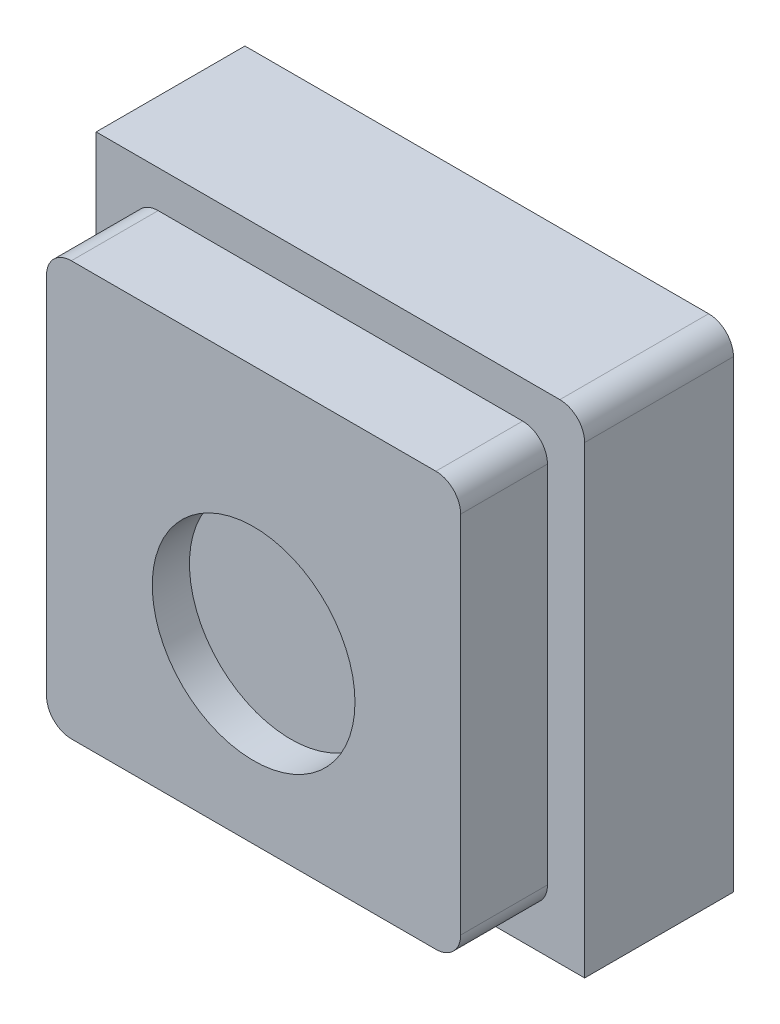
ISO-10303-21;
HEADER;
FILE_DESCRIPTION(('STEP AP214'),'2;1');
FILE_NAME('part.step','',(''),(''),'','','');
FILE_SCHEMA(('AUTOMOTIVE_DESIGN { 1 0 10303 214 1 1 1 1 }'));
ENDSEC;
DATA;
#1=APPLICATION_CONTEXT('core data for automotive mechanical design processes');
#2=APPLICATION_PROTOCOL_DEFINITION('international standard','automotive_design',2000,#1);
#3=PRODUCT_CONTEXT('',#1,'mechanical');
#4=PRODUCT('Part','Part','',(#3));
#5=PRODUCT_RELATED_PRODUCT_CATEGORY('part','',(#4));
#6=PRODUCT_DEFINITION_FORMATION('','',#4);
#7=PRODUCT_DEFINITION_CONTEXT('part definition',#1,'design');
#8=PRODUCT_DEFINITION('design','',#6,#7);
#9=PRODUCT_DEFINITION_SHAPE('','',#8);
#10=(LENGTH_UNIT() NAMED_UNIT(*) SI_UNIT(.MILLI.,.METRE.));
#11=(NAMED_UNIT(*) PLANE_ANGLE_UNIT() SI_UNIT($,.RADIAN.));
#12=(NAMED_UNIT(*) SI_UNIT($,.STERADIAN.) SOLID_ANGLE_UNIT());
#13=UNCERTAINTY_MEASURE_WITH_UNIT(LENGTH_MEASURE(1.E-05),#10,'distance_accuracy_value','');
#14=(GEOMETRIC_REPRESENTATION_CONTEXT(3) GLOBAL_UNCERTAINTY_ASSIGNED_CONTEXT((#13)) GLOBAL_UNIT_ASSIGNED_CONTEXT((#10,
#11,#12)) REPRESENTATION_CONTEXT('',''));
#15=CARTESIAN_POINT('',(0.,0.,0.));
#16=DIRECTION('',(0.,0.,1.));
#17=DIRECTION('',(1.,0.,0.));
#18=AXIS2_PLACEMENT_3D('',#15,#16,#17);
#19=CARTESIAN_POINT('',(-16.7,16.7,7.));
#20=DIRECTION('',(1.,0.,0.));
#21=DIRECTION('',(0.,1.,0.));
#22=AXIS2_PLACEMENT_3D('',#19,#20,#21);
#23=PLANE('',#22);
#24=DIRECTION('',(0.,-1.,0.));
#25=VECTOR('',#24,1.);
#26=CARTESIAN_POINT('',(-16.7,16.7,7.));
#27=LINE('',#26,#25);
#28=CARTESIAN_POINT('',(-16.7,14.7,7.));
#29=VERTEX_POINT('',#28);
#30=CARTESIAN_POINT('',(-16.7,-14.7,7.));
#31=VERTEX_POINT('',#30);
#32=EDGE_CURVE('E251',#29,#31,#27,.T.);
#33=ORIENTED_EDGE('',*,*,#32,.F.);
#34=DIRECTION('',(0.,0.,-1.));
#35=VECTOR('',#34,1.);
#36=CARTESIAN_POINT('',(-16.7,14.7,7.));
#37=LINE('',#36,#35);
#38=CARTESIAN_POINT('',(-16.7,14.7,0.));
#39=VERTEX_POINT('',#38);
#40=EDGE_CURVE('E233',#29,#39,#37,.T.);
#41=ORIENTED_EDGE('',*,*,#40,.T.);
#42=DIRECTION('',(0.,-1.,0.));
#43=VECTOR('',#42,1.);
#44=CARTESIAN_POINT('',(-16.7,16.7,0.));
#45=LINE('',#44,#43);
#46=CARTESIAN_POINT('',(-16.7,-14.7,0.));
#47=VERTEX_POINT('',#46);
#48=EDGE_CURVE('E246',#39,#47,#45,.T.);
#49=ORIENTED_EDGE('',*,*,#48,.T.);
#50=DIRECTION('',(0.,0.,-1.));
#51=VECTOR('',#50,1.);
#52=CARTESIAN_POINT('',(-16.7,-14.7,7.));
#53=LINE('',#52,#51);
#54=EDGE_CURVE('E231',#47,#31,#53,.F.);
#55=ORIENTED_EDGE('',*,*,#54,.T.);
#56=EDGE_LOOP('',(#33,#41,#49,#55));
#57=FACE_BOUND('',#56,.T.);
#58=ADVANCED_FACE('F35',(#57),#23,.F.);
#59=CARTESIAN_POINT('',(-16.7,-16.7,7.));
#60=DIRECTION('',(0.,1.,0.));
#61=DIRECTION('',(0.,0.,1.));
#62=AXIS2_PLACEMENT_3D('',#59,#60,#61);
#63=PLANE('',#62);
#64=DIRECTION('',(1.,0.,0.));
#65=VECTOR('',#64,1.);
#66=CARTESIAN_POINT('',(-16.7,-16.7,0.));
#67=LINE('',#66,#65);
#68=CARTESIAN_POINT('',(-14.7,-16.7,0.));
#69=VERTEX_POINT('',#68);
#70=CARTESIAN_POINT('',(14.7,-16.7,0.));
#71=VERTEX_POINT('',#70);
#72=EDGE_CURVE('E274',#69,#71,#67,.T.);
#73=ORIENTED_EDGE('',*,*,#72,.T.);
#74=DIRECTION('',(0.,0.,-1.));
#75=VECTOR('',#74,1.);
#76=CARTESIAN_POINT('',(14.7,-16.7,7.));
#77=LINE('',#76,#75);
#78=CARTESIAN_POINT('',(14.7,-16.7,7.));
#79=VERTEX_POINT('',#78);
#80=EDGE_CURVE('E218',#71,#79,#77,.F.);
#81=ORIENTED_EDGE('',*,*,#80,.T.);
#82=DIRECTION('',(1.,0.,0.));
#83=VECTOR('',#82,1.);
#84=CARTESIAN_POINT('',(-16.7,-16.7,7.));
#85=LINE('',#84,#83);
#86=CARTESIAN_POINT('',(-14.7,-16.7,7.));
#87=VERTEX_POINT('',#86);
#88=EDGE_CURVE('E263',#87,#79,#85,.T.);
#89=ORIENTED_EDGE('',*,*,#88,.F.);
#90=DIRECTION('',(0.,0.,-1.));
#91=VECTOR('',#90,1.);
#92=CARTESIAN_POINT('',(-14.7,-16.7,7.));
#93=LINE('',#92,#91);
#94=EDGE_CURVE('E215',#87,#69,#93,.T.);
#95=ORIENTED_EDGE('',*,*,#94,.T.);
#96=EDGE_LOOP('',(#73,#81,#89,#95));
#97=FACE_BOUND('',#96,.T.);
#98=ADVANCED_FACE('F318',(#97),#63,.F.);
#99=CARTESIAN_POINT('',(16.7,16.7,7.));
#100=DIRECTION('',(-1.,0.,0.));
#101=DIRECTION('',(0.,0.,1.));
#102=AXIS2_PLACEMENT_3D('',#99,#100,#101);
#103=PLANE('',#102);
#104=DIRECTION('',(0.,1.,0.));
#105=VECTOR('',#104,1.);
#106=CARTESIAN_POINT('',(16.7,16.7,7.));
#107=LINE('',#106,#105);
#108=CARTESIAN_POINT('',(16.7,-14.7,7.));
#109=VERTEX_POINT('',#108);
#110=CARTESIAN_POINT('',(16.7,14.7,7.));
#111=VERTEX_POINT('',#110);
#112=EDGE_CURVE('E265',#109,#111,#107,.T.);
#113=ORIENTED_EDGE('',*,*,#112,.F.);
#114=DIRECTION('',(0.,0.,-1.));
#115=VECTOR('',#114,1.);
#116=CARTESIAN_POINT('',(16.7,-14.7,7.));
#117=LINE('',#116,#115);
#118=CARTESIAN_POINT('',(16.7,-14.7,0.));
#119=VERTEX_POINT('',#118);
#120=EDGE_CURVE('E212',#109,#119,#117,.T.);
#121=ORIENTED_EDGE('',*,*,#120,.T.);
#122=DIRECTION('',(0.,1.,0.));
#123=VECTOR('',#122,1.);
#124=CARTESIAN_POINT('',(16.7,16.7,0.));
#125=LINE('',#124,#123);
#126=CARTESIAN_POINT('',(16.7,14.7,0.));
#127=VERTEX_POINT('',#126);
#128=EDGE_CURVE('E252',#119,#127,#125,.T.);
#129=ORIENTED_EDGE('',*,*,#128,.T.);
#130=DIRECTION('',(0.,0.,-1.));
#131=VECTOR('',#130,1.);
#132=CARTESIAN_POINT('',(16.7,14.7,7.));
#133=LINE('',#132,#131);
#134=EDGE_CURVE('E210',#127,#111,#133,.F.);
#135=ORIENTED_EDGE('',*,*,#134,.T.);
#136=EDGE_LOOP('',(#113,#121,#129,#135));
#137=FACE_BOUND('',#136,.T.);
#138=ADVANCED_FACE('F315',(#137),#103,.F.);
#139=CARTESIAN_POINT('',(-16.7,16.7,7.));
#140=DIRECTION('',(0.,-1.,0.));
#141=DIRECTION('',(0.,0.,-1.));
#142=AXIS2_PLACEMENT_3D('',#139,#140,#141);
#143=PLANE('',#142);
#144=DIRECTION('',(-1.,0.,0.));
#145=VECTOR('',#144,1.);
#146=CARTESIAN_POINT('',(-16.7,16.7,7.));
#147=LINE('',#146,#145);
#148=CARTESIAN_POINT('',(14.7,16.7,7.));
#149=VERTEX_POINT('',#148);
#150=CARTESIAN_POINT('',(-14.7,16.7,7.));
#151=VERTEX_POINT('',#150);
#152=EDGE_CURVE('E205',#149,#151,#147,.T.);
#153=ORIENTED_EDGE('',*,*,#152,.F.);
#154=DIRECTION('',(0.,0.,-1.));
#155=VECTOR('',#154,1.);
#156=CARTESIAN_POINT('',(14.7,16.7,7.));
#157=LINE('',#156,#155);
#158=CARTESIAN_POINT('',(14.7,16.7,0.));
#159=VERTEX_POINT('',#158);
#160=EDGE_CURVE('E228',#149,#159,#157,.T.);
#161=ORIENTED_EDGE('',*,*,#160,.T.);
#162=DIRECTION('',(-1.,0.,0.));
#163=VECTOR('',#162,1.);
#164=CARTESIAN_POINT('',(-16.7,16.7,0.));
#165=LINE('',#164,#163);
#166=CARTESIAN_POINT('',(-14.7,16.7,0.));
#167=VERTEX_POINT('',#166);
#168=EDGE_CURVE('E244',#159,#167,#165,.T.);
#169=ORIENTED_EDGE('',*,*,#168,.T.);
#170=DIRECTION('',(0.,0.,-1.));
#171=VECTOR('',#170,1.);
#172=CARTESIAN_POINT('',(-14.7,16.7,7.));
#173=LINE('',#172,#171);
#174=EDGE_CURVE('E50',#167,#151,#173,.F.);
#175=ORIENTED_EDGE('',*,*,#174,.T.);
#176=EDGE_LOOP('',(#153,#161,#169,#175));
#177=FACE_BOUND('',#176,.T.);
#178=ADVANCED_FACE('F249',(#177),#143,.F.);
#179=CARTESIAN_POINT('',(0.,0.,7.));
#180=DIRECTION('',(0.,0.,1.));
#181=DIRECTION('',(1.,0.,0.));
#182=AXIS2_PLACEMENT_3D('',#179,#180,#181);
#183=PLANE('',#182);
#184=CARTESIAN_POINT('',(0.,-2.7,7.));
#185=DIRECTION('',(0.,0.,1.));
#186=DIRECTION('',(1.,0.,0.));
#187=AXIS2_PLACEMENT_3D('',#184,#185,#186);
#188=CIRCLE('',#187,8.175);
#189=CARTESIAN_POINT('',(8.175,-2.7,7.));
#190=VERTEX_POINT('',#189);
#191=EDGE_CURVE('E268',#190,#190,#188,.T.);
#192=ORIENTED_EDGE('',*,*,#191,.F.);
#193=EDGE_LOOP('',(#192));
#194=FACE_BOUND('',#193,.T.);
#195=ORIENTED_EDGE('',*,*,#88,.T.);
#196=CARTESIAN_POINT('',(14.7,-14.7,7.));
#197=DIRECTION('',(0.,0.,1.));
#198=DIRECTION('',(1.,0.,0.));
#199=AXIS2_PLACEMENT_3D('',#196,#197,#198);
#200=CIRCLE('',#199,2.);
#201=EDGE_CURVE('E225',#79,#109,#200,.T.);
#202=ORIENTED_EDGE('',*,*,#201,.T.);
#203=ORIENTED_EDGE('',*,*,#112,.T.);
#204=CARTESIAN_POINT('',(14.7,14.7,7.));
#205=DIRECTION('',(0.,0.,1.));
#206=DIRECTION('',(1.,0.,0.));
#207=AXIS2_PLACEMENT_3D('',#204,#205,#206);
#208=CIRCLE('',#207,2.);
#209=EDGE_CURVE('E57',#111,#149,#208,.T.);
#210=ORIENTED_EDGE('',*,*,#209,.T.);
#211=ORIENTED_EDGE('',*,*,#152,.T.);
#212=CARTESIAN_POINT('',(-14.7,14.7,7.));
#213=DIRECTION('',(0.,0.,1.));
#214=DIRECTION('',(1.,0.,0.));
#215=AXIS2_PLACEMENT_3D('',#212,#213,#214);
#216=CIRCLE('',#215,2.);
#217=EDGE_CURVE('E222',#151,#29,#216,.T.);
#218=ORIENTED_EDGE('',*,*,#217,.T.);
#219=ORIENTED_EDGE('',*,*,#32,.T.);
#220=CARTESIAN_POINT('',(-14.7,-14.7,7.));
#221=DIRECTION('',(0.,0.,1.));
#222=DIRECTION('',(1.,0.,0.));
#223=AXIS2_PLACEMENT_3D('',#220,#221,#222);
#224=CIRCLE('',#223,2.);
#225=EDGE_CURVE('E220',#31,#87,#224,.T.);
#226=ORIENTED_EDGE('',*,*,#225,.T.);
#227=EDGE_LOOP('',(#195,#202,#203,#210,#211,#218,#219,#226));
#228=FACE_BOUND('',#227,.T.);
#229=ADVANCED_FACE('F259',(#194,#228),#183,.T.);
#230=CARTESIAN_POINT('',(0.,-2.7,4.));
#231=DIRECTION('',(0.,0.,1.));
#232=DIRECTION('',(1.,0.,0.));
#233=AXIS2_PLACEMENT_3D('',#230,#231,#232);
#234=CYLINDRICAL_SURFACE('',#233,8.175);
#235=CARTESIAN_POINT('',(0.,-2.7,4.));
#236=DIRECTION('',(0.,0.,1.));
#237=DIRECTION('',(1.,0.,0.));
#238=AXIS2_PLACEMENT_3D('',#235,#236,#237);
#239=CIRCLE('',#238,8.175);
#240=CARTESIAN_POINT('',(8.175,-2.7,4.));
#241=VERTEX_POINT('',#240);
#242=EDGE_CURVE('E275',#241,#241,#239,.T.);
#243=ORIENTED_EDGE('',*,*,#242,.F.);
#244=EDGE_LOOP('',(#243));
#245=FACE_BOUND('',#244,.T.);
#246=ORIENTED_EDGE('',*,*,#191,.T.);
#247=EDGE_LOOP('',(#246));
#248=FACE_BOUND('',#247,.T.);
#249=ADVANCED_FACE('F304',(#245,#248),#234,.F.);
#250=CARTESIAN_POINT('',(0.,-2.7,4.));
#251=DIRECTION('',(0.,0.,1.));
#252=DIRECTION('',(1.,0.,0.));
#253=AXIS2_PLACEMENT_3D('',#250,#251,#252);
#254=PLANE('',#253);
#255=ORIENTED_EDGE('',*,*,#242,.T.);
#256=EDGE_LOOP('',(#255));
#257=FACE_BOUND('',#256,.T.);
#258=ADVANCED_FACE('F312',(#257),#254,.T.);
#259=CARTESIAN_POINT('',(0.,0.,0.));
#260=DIRECTION('',(0.,0.,-1.));
#261=DIRECTION('',(-1.,0.,0.));
#262=AXIS2_PLACEMENT_3D('',#259,#260,#261);
#263=PLANE('',#262);
#264=DIRECTION('',(0.,-1.,0.));
#265=VECTOR('',#264,1.);
#266=CARTESIAN_POINT('',(19.7,19.7,0.));
#267=LINE('',#266,#265);
#268=CARTESIAN_POINT('',(19.7,17.7,0.));
#269=VERTEX_POINT('',#268);
#270=CARTESIAN_POINT('',(19.7,-19.7,0.));
#271=VERTEX_POINT('',#270);
#272=EDGE_CURVE('E288',#269,#271,#267,.T.);
#273=ORIENTED_EDGE('',*,*,#272,.F.);
#274=CARTESIAN_POINT('',(17.7,17.7,0.));
#275=DIRECTION('',(0.,0.,-1.));
#276=DIRECTION('',(-1.,0.,0.));
#277=AXIS2_PLACEMENT_3D('',#274,#275,#276);
#278=CIRCLE('',#277,2.);
#279=CARTESIAN_POINT('',(17.7,19.7,0.));
#280=VERTEX_POINT('',#279);
#281=EDGE_CURVE('E204',#269,#280,#278,.F.);
#282=ORIENTED_EDGE('',*,*,#281,.T.);
#283=DIRECTION('',(1.,0.,0.));
#284=VECTOR('',#283,1.);
#285=CARTESIAN_POINT('',(19.7,19.7,0.));
#286=LINE('',#285,#284);
#287=CARTESIAN_POINT('',(-19.7,19.7,0.));
#288=VERTEX_POINT('',#287);
#289=EDGE_CURVE('E282',#288,#280,#286,.T.);
#290=ORIENTED_EDGE('',*,*,#289,.F.);
#291=DIRECTION('',(0.,1.,0.));
#292=VECTOR('',#291,1.);
#293=CARTESIAN_POINT('',(-19.7,19.7,0.));
#294=LINE('',#293,#292);
#295=CARTESIAN_POINT('',(-19.7,-19.7,0.));
#296=VERTEX_POINT('',#295);
#297=EDGE_CURVE('E157',#296,#288,#294,.T.);
#298=ORIENTED_EDGE('',*,*,#297,.F.);
#299=DIRECTION('',(-1.,0.,0.));
#300=VECTOR('',#299,1.);
#301=CARTESIAN_POINT('',(19.7,-19.7,0.));
#302=LINE('',#301,#300);
#303=EDGE_CURVE('E290',#271,#296,#302,.T.);
#304=ORIENTED_EDGE('',*,*,#303,.F.);
#305=EDGE_LOOP('',(#273,#282,#290,#298,#304));
#306=FACE_BOUND('',#305,.T.);
#307=ORIENTED_EDGE('',*,*,#72,.F.);
#308=CARTESIAN_POINT('',(-14.7,-14.7,0.));
#309=DIRECTION('',(0.,0.,-1.));
#310=DIRECTION('',(-1.,0.,0.));
#311=AXIS2_PLACEMENT_3D('',#308,#309,#310);
#312=CIRCLE('',#311,2.);
#313=EDGE_CURVE('E11',#69,#47,#312,.T.);
#314=ORIENTED_EDGE('',*,*,#313,.T.);
#315=ORIENTED_EDGE('',*,*,#48,.F.);
#316=CARTESIAN_POINT('',(-14.7,14.7,0.));
#317=DIRECTION('',(0.,0.,-1.));
#318=DIRECTION('',(-1.,0.,0.));
#319=AXIS2_PLACEMENT_3D('',#316,#317,#318);
#320=CIRCLE('',#319,2.);
#321=EDGE_CURVE('E43',#39,#167,#320,.T.);
#322=ORIENTED_EDGE('',*,*,#321,.T.);
#323=ORIENTED_EDGE('',*,*,#168,.F.);
#324=CARTESIAN_POINT('',(14.7,14.7,0.));
#325=DIRECTION('',(0.,0.,-1.));
#326=DIRECTION('',(-1.,0.,0.));
#327=AXIS2_PLACEMENT_3D('',#324,#325,#326);
#328=CIRCLE('',#327,2.);
#329=EDGE_CURVE('E238',#159,#127,#328,.T.);
#330=ORIENTED_EDGE('',*,*,#329,.T.);
#331=ORIENTED_EDGE('',*,*,#128,.F.);
#332=CARTESIAN_POINT('',(14.7,-14.7,0.));
#333=DIRECTION('',(0.,0.,-1.));
#334=DIRECTION('',(-1.,0.,0.));
#335=AXIS2_PLACEMENT_3D('',#332,#333,#334);
#336=CIRCLE('',#335,2.);
#337=EDGE_CURVE('E236',#119,#71,#336,.T.);
#338=ORIENTED_EDGE('',*,*,#337,.T.);
#339=EDGE_LOOP('',(#307,#314,#315,#322,#323,#330,#331,#338));
#340=FACE_BOUND('',#339,.T.);
#341=ADVANCED_FACE('F243',(#306,#340),#263,.F.);
#342=CARTESIAN_POINT('',(19.7,19.7,-2.));
#343=DIRECTION('',(-1.,0.,0.));
#344=DIRECTION('',(0.,-1.,0.));
#345=AXIS2_PLACEMENT_3D('',#342,#343,#344);
#346=PLANE('',#345);
#347=DIRECTION('',(0.,-1.,0.));
#348=VECTOR('',#347,1.);
#349=CARTESIAN_POINT('',(19.7,19.7,-12.));
#350=LINE('',#349,#348);
#351=CARTESIAN_POINT('',(19.7,17.7,-12.));
#352=VERTEX_POINT('',#351);
#353=CARTESIAN_POINT('',(19.7,-19.7,-12.));
#354=VERTEX_POINT('',#353);
#355=EDGE_CURVE('E171',#352,#354,#350,.T.);
#356=ORIENTED_EDGE('',*,*,#355,.F.);
#357=DIRECTION('',(0.,0.,1.));
#358=VECTOR('',#357,1.);
#359=CARTESIAN_POINT('',(19.7,17.7,-2.));
#360=LINE('',#359,#358);
#361=EDGE_CURVE('E201',#352,#269,#360,.T.);
#362=ORIENTED_EDGE('',*,*,#361,.T.);
#363=ORIENTED_EDGE('',*,*,#272,.T.);
#364=DIRECTION('',(0.,0.,1.));
#365=VECTOR('',#364,1.);
#366=CARTESIAN_POINT('',(19.7,-19.7,-2.));
#367=LINE('',#366,#365);
#368=EDGE_CURVE('E296',#354,#271,#367,.T.);
#369=ORIENTED_EDGE('',*,*,#368,.F.);
#370=EDGE_LOOP('',(#356,#362,#363,#369));
#371=FACE_BOUND('',#370,.T.);
#372=ADVANCED_FACE('F377',(#371),#346,.F.);
#373=CARTESIAN_POINT('',(19.7,-19.7,-2.));
#374=DIRECTION('',(0.,1.,0.));
#375=DIRECTION('',(0.,0.,1.));
#376=AXIS2_PLACEMENT_3D('',#373,#374,#375);
#377=PLANE('',#376);
#378=ORIENTED_EDGE('',*,*,#303,.T.);
#379=DIRECTION('',(0.,0.,1.));
#380=VECTOR('',#379,1.);
#381=CARTESIAN_POINT('',(-19.7,-19.7,-2.));
#382=LINE('',#381,#380);
#383=CARTESIAN_POINT('',(-19.7,-19.7,-2.));
#384=VERTEX_POINT('',#383);
#385=EDGE_CURVE('E161',#384,#296,#382,.T.);
#386=ORIENTED_EDGE('',*,*,#385,.F.);
#387=DIRECTION('',(-1.,0.,0.));
#388=VECTOR('',#387,1.);
#389=CARTESIAN_POINT('',(19.7,-19.7,-2.));
#390=LINE('',#389,#388);
#391=CARTESIAN_POINT('',(16.7,-19.7,-2.));
#392=VERTEX_POINT('',#391);
#393=EDGE_CURVE('E280',#392,#384,#390,.T.);
#394=ORIENTED_EDGE('',*,*,#393,.F.);
#395=DIRECTION('',(0.,0.,1.));
#396=VECTOR('',#395,1.);
#397=CARTESIAN_POINT('',(16.7,-19.7,-12.));
#398=LINE('',#397,#396);
#399=CARTESIAN_POINT('',(16.7,-19.7,-12.));
#400=VERTEX_POINT('',#399);
#401=EDGE_CURVE('E291',#400,#392,#398,.T.);
#402=ORIENTED_EDGE('',*,*,#401,.F.);
#403=DIRECTION('',(-1.,0.,0.));
#404=VECTOR('',#403,1.);
#405=CARTESIAN_POINT('',(19.7,-19.7,-12.));
#406=LINE('',#405,#404);
#407=EDGE_CURVE('E184',#354,#400,#406,.T.);
#408=ORIENTED_EDGE('',*,*,#407,.F.);
#409=ORIENTED_EDGE('',*,*,#368,.T.);
#410=EDGE_LOOP('',(#378,#386,#394,#402,#408,#409));
#411=FACE_BOUND('',#410,.T.);
#412=ADVANCED_FACE('F390',(#411),#377,.F.);
#413=CARTESIAN_POINT('',(-19.7,19.7,-2.));
#414=DIRECTION('',(1.,0.,0.));
#415=DIRECTION('',(0.,1.,0.));
#416=AXIS2_PLACEMENT_3D('',#413,#414,#415);
#417=PLANE('',#416);
#418=ORIENTED_EDGE('',*,*,#297,.T.);
#419=DIRECTION('',(0.,0.,1.));
#420=VECTOR('',#419,1.);
#421=CARTESIAN_POINT('',(-19.7,19.7,-2.));
#422=LINE('',#421,#420);
#423=CARTESIAN_POINT('',(-19.7,19.7,-12.));
#424=VERTEX_POINT('',#423);
#425=EDGE_CURVE('E149',#424,#288,#422,.T.);
#426=ORIENTED_EDGE('',*,*,#425,.F.);
#427=DIRECTION('',(0.,1.,0.));
#428=VECTOR('',#427,1.);
#429=CARTESIAN_POINT('',(-19.7,16.7,-12.));
#430=LINE('',#429,#428);
#431=CARTESIAN_POINT('',(-19.7,16.7,-12.));
#432=VERTEX_POINT('',#431);
#433=EDGE_CURVE('E154',#432,#424,#430,.T.);
#434=ORIENTED_EDGE('',*,*,#433,.F.);
#435=DIRECTION('',(0.,0.,1.));
#436=VECTOR('',#435,1.);
#437=CARTESIAN_POINT('',(-19.7,16.7,-12.));
#438=LINE('',#437,#436);
#439=CARTESIAN_POINT('',(-19.7,16.7,-2.));
#440=VERTEX_POINT('',#439);
#441=EDGE_CURVE('E189',#432,#440,#438,.T.);
#442=ORIENTED_EDGE('',*,*,#441,.T.);
#443=DIRECTION('',(0.,1.,0.));
#444=VECTOR('',#443,1.);
#445=CARTESIAN_POINT('',(-19.7,19.7,-2.));
#446=LINE('',#445,#444);
#447=EDGE_CURVE('E162',#384,#440,#446,.T.);
#448=ORIENTED_EDGE('',*,*,#447,.F.);
#449=ORIENTED_EDGE('',*,*,#385,.T.);
#450=EDGE_LOOP('',(#418,#426,#434,#442,#448,#449));
#451=FACE_BOUND('',#450,.T.);
#452=ADVANCED_FACE('F151',(#451),#417,.F.);
#453=CARTESIAN_POINT('',(19.7,19.7,-2.));
#454=DIRECTION('',(0.,-1.,0.));
#455=DIRECTION('',(0.,0.,-1.));
#456=AXIS2_PLACEMENT_3D('',#453,#454,#455);
#457=PLANE('',#456);
#458=ORIENTED_EDGE('',*,*,#289,.T.);
#459=DIRECTION('',(0.,0.,1.));
#460=VECTOR('',#459,1.);
#461=CARTESIAN_POINT('',(17.7,19.7,-2.));
#462=LINE('',#461,#460);
#463=CARTESIAN_POINT('',(17.7,19.7,-12.));
#464=VERTEX_POINT('',#463);
#465=EDGE_CURVE('E168',#280,#464,#462,.F.);
#466=ORIENTED_EDGE('',*,*,#465,.T.);
#467=DIRECTION('',(1.,0.,0.));
#468=VECTOR('',#467,1.);
#469=CARTESIAN_POINT('',(-19.7,19.7,-12.));
#470=LINE('',#469,#468);
#471=EDGE_CURVE('E165',#424,#464,#470,.T.);
#472=ORIENTED_EDGE('',*,*,#471,.F.);
#473=ORIENTED_EDGE('',*,*,#425,.T.);
#474=EDGE_LOOP('',(#458,#466,#472,#473));
#475=FACE_BOUND('',#474,.T.);
#476=ADVANCED_FACE('F166',(#475),#457,.F.);
#477=CARTESIAN_POINT('',(0.,0.,-2.));
#478=DIRECTION('',(0.,0.,-1.));
#479=DIRECTION('',(-1.,0.,0.));
#480=AXIS2_PLACEMENT_3D('',#477,#478,#479);
#481=PLANE('',#480);
#482=DIRECTION('',(-1.,0.,0.));
#483=VECTOR('',#482,1.);
#484=CARTESIAN_POINT('',(16.7,16.7,-2.));
#485=LINE('',#484,#483);
#486=CARTESIAN_POINT('',(16.7,16.7,-2.));
#487=VERTEX_POINT('',#486);
#488=EDGE_CURVE('E177',#487,#440,#485,.T.);
#489=ORIENTED_EDGE('',*,*,#488,.F.);
#490=DIRECTION('',(0.,1.,0.));
#491=VECTOR('',#490,1.);
#492=CARTESIAN_POINT('',(16.7,-19.7,-2.));
#493=LINE('',#492,#491);
#494=EDGE_CURVE('E180',#392,#487,#493,.T.);
#495=ORIENTED_EDGE('',*,*,#494,.F.);
#496=ORIENTED_EDGE('',*,*,#393,.T.);
#497=ORIENTED_EDGE('',*,*,#447,.T.);
#498=EDGE_LOOP('',(#489,#495,#496,#497));
#499=FACE_BOUND('',#498,.T.);
#500=ADVANCED_FACE('F403',(#499),#481,.T.);
#501=CARTESIAN_POINT('',(16.7,-19.7,-12.));
#502=DIRECTION('',(1.,0.,0.));
#503=DIRECTION('',(0.,0.,-1.));
#504=AXIS2_PLACEMENT_3D('',#501,#502,#503);
#505=PLANE('',#504);
#506=ORIENTED_EDGE('',*,*,#494,.T.);
#507=DIRECTION('',(0.,0.,1.));
#508=VECTOR('',#507,1.);
#509=CARTESIAN_POINT('',(16.7,16.7,-12.));
#510=LINE('',#509,#508);
#511=CARTESIAN_POINT('',(16.7,16.7,-12.));
#512=VERTEX_POINT('',#511);
#513=EDGE_CURVE('E192',#512,#487,#510,.T.);
#514=ORIENTED_EDGE('',*,*,#513,.F.);
#515=DIRECTION('',(0.,1.,0.));
#516=VECTOR('',#515,1.);
#517=CARTESIAN_POINT('',(16.7,-19.7,-12.));
#518=LINE('',#517,#516);
#519=EDGE_CURVE('E186',#400,#512,#518,.T.);
#520=ORIENTED_EDGE('',*,*,#519,.F.);
#521=ORIENTED_EDGE('',*,*,#401,.T.);
#522=EDGE_LOOP('',(#506,#514,#520,#521));
#523=FACE_BOUND('',#522,.T.);
#524=ADVANCED_FACE('F452',(#523),#505,.F.);
#525=CARTESIAN_POINT('',(16.7,16.7,-12.));
#526=DIRECTION('',(0.,1.,0.));
#527=DIRECTION('',(-1.,0.,0.));
#528=AXIS2_PLACEMENT_3D('',#525,#526,#527);
#529=PLANE('',#528);
#530=ORIENTED_EDGE('',*,*,#488,.T.);
#531=ORIENTED_EDGE('',*,*,#441,.F.);
#532=DIRECTION('',(-1.,0.,0.));
#533=VECTOR('',#532,1.);
#534=CARTESIAN_POINT('',(16.7,16.7,-12.));
#535=LINE('',#534,#533);
#536=EDGE_CURVE('E175',#512,#432,#535,.T.);
#537=ORIENTED_EDGE('',*,*,#536,.F.);
#538=ORIENTED_EDGE('',*,*,#513,.T.);
#539=EDGE_LOOP('',(#530,#531,#537,#538));
#540=FACE_BOUND('',#539,.T.);
#541=ADVANCED_FACE('F417',(#540),#529,.F.);
#542=CARTESIAN_POINT('',(0.,0.,-12.));
#543=DIRECTION('',(0.,0.,-1.));
#544=DIRECTION('',(-1.,0.,0.));
#545=AXIS2_PLACEMENT_3D('',#542,#543,#544);
#546=PLANE('',#545);
#547=ORIENTED_EDGE('',*,*,#471,.T.);
#548=CARTESIAN_POINT('',(17.7,17.7,-12.));
#549=DIRECTION('',(0.,0.,-1.));
#550=DIRECTION('',(-1.,0.,0.));
#551=AXIS2_PLACEMENT_3D('',#548,#549,#550);
#552=CIRCLE('',#551,2.);
#553=EDGE_CURVE('E208',#464,#352,#552,.T.);
#554=ORIENTED_EDGE('',*,*,#553,.T.);
#555=ORIENTED_EDGE('',*,*,#355,.T.);
#556=ORIENTED_EDGE('',*,*,#407,.T.);
#557=ORIENTED_EDGE('',*,*,#519,.T.);
#558=ORIENTED_EDGE('',*,*,#536,.T.);
#559=ORIENTED_EDGE('',*,*,#433,.T.);
#560=EDGE_LOOP('',(#547,#554,#555,#556,#557,#558,#559));
#561=FACE_BOUND('',#560,.T.);
#562=ADVANCED_FACE('F173',(#561),#546,.T.);
#563=CARTESIAN_POINT('',(17.7,17.7,-2.));
#564=DIRECTION('',(0.,0.,1.));
#565=DIRECTION('',(1.,0.,0.));
#566=AXIS2_PLACEMENT_3D('',#563,#564,#565);
#567=CYLINDRICAL_SURFACE('',#566,2.);
#568=ORIENTED_EDGE('',*,*,#553,.F.);
#569=ORIENTED_EDGE('',*,*,#465,.F.);
#570=ORIENTED_EDGE('',*,*,#281,.F.);
#571=ORIENTED_EDGE('',*,*,#361,.F.);
#572=EDGE_LOOP('',(#568,#569,#570,#571));
#573=FACE_BOUND('',#572,.T.);
#574=ADVANCED_FACE('F327',(#573),#567,.T.);
#575=CARTESIAN_POINT('',(14.7,-14.7,7.));
#576=DIRECTION('',(0.,0.,-1.));
#577=DIRECTION('',(-1.,0.,0.));
#578=AXIS2_PLACEMENT_3D('',#575,#576,#577);
#579=CYLINDRICAL_SURFACE('',#578,2.);
#580=ORIENTED_EDGE('',*,*,#201,.F.);
#581=ORIENTED_EDGE('',*,*,#80,.F.);
#582=ORIENTED_EDGE('',*,*,#337,.F.);
#583=ORIENTED_EDGE('',*,*,#120,.F.);
#584=EDGE_LOOP('',(#580,#581,#582,#583));
#585=FACE_BOUND('',#584,.T.);
#586=ADVANCED_FACE('F330',(#585),#579,.T.);
#587=CARTESIAN_POINT('',(14.7,14.7,7.));
#588=DIRECTION('',(0.,0.,-1.));
#589=DIRECTION('',(-1.,0.,0.));
#590=AXIS2_PLACEMENT_3D('',#587,#588,#589);
#591=CYLINDRICAL_SURFACE('',#590,2.);
#592=ORIENTED_EDGE('',*,*,#209,.F.);
#593=ORIENTED_EDGE('',*,*,#134,.F.);
#594=ORIENTED_EDGE('',*,*,#329,.F.);
#595=ORIENTED_EDGE('',*,*,#160,.F.);
#596=EDGE_LOOP('',(#592,#593,#594,#595));
#597=FACE_BOUND('',#596,.T.);
#598=ADVANCED_FACE('F334',(#597),#591,.T.);
#599=CARTESIAN_POINT('',(-14.7,14.7,7.));
#600=DIRECTION('',(0.,0.,-1.));
#601=DIRECTION('',(-1.,0.,0.));
#602=AXIS2_PLACEMENT_3D('',#599,#600,#601);
#603=CYLINDRICAL_SURFACE('',#602,2.);
#604=ORIENTED_EDGE('',*,*,#217,.F.);
#605=ORIENTED_EDGE('',*,*,#174,.F.);
#606=ORIENTED_EDGE('',*,*,#321,.F.);
#607=ORIENTED_EDGE('',*,*,#40,.F.);
#608=EDGE_LOOP('',(#604,#605,#606,#607));
#609=FACE_BOUND('',#608,.T.);
#610=ADVANCED_FACE('F255',(#609),#603,.T.);
#611=CARTESIAN_POINT('',(-14.7,-14.7,7.));
#612=DIRECTION('',(0.,0.,-1.));
#613=DIRECTION('',(-1.,0.,0.));
#614=AXIS2_PLACEMENT_3D('',#611,#612,#613);
#615=CYLINDRICAL_SURFACE('',#614,2.);
#616=ORIENTED_EDGE('',*,*,#225,.F.);
#617=ORIENTED_EDGE('',*,*,#54,.F.);
#618=ORIENTED_EDGE('',*,*,#313,.F.);
#619=ORIENTED_EDGE('',*,*,#94,.F.);
#620=EDGE_LOOP('',(#616,#617,#618,#619));
#621=FACE_BOUND('',#620,.T.);
#622=ADVANCED_FACE('F37',(#621),#615,.T.);
#623=CLOSED_SHELL('',(#58,#98,#138,#178,#229,#249,#258,#341,#372,#412,#452,#476,#500,#524,#541,
#562,#574,#586,#598,#610,#622));
#624=MANIFOLD_SOLID_BREP('B2',#623);
#625=ADVANCED_BREP_SHAPE_REPRESENTATION('',(#18,#624),#14);
#626=SHAPE_DEFINITION_REPRESENTATION(#9,#625);
ENDSEC;
END-ISO-10303-21;
